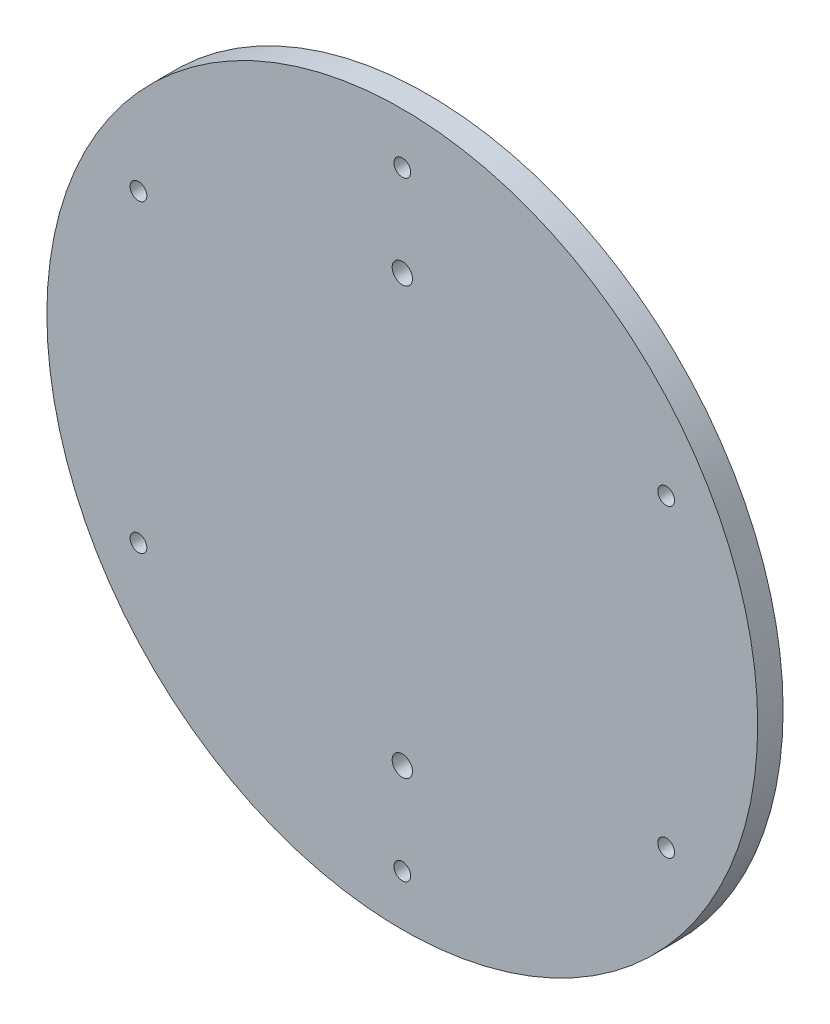
ISO-10303-21;
HEADER;
FILE_DESCRIPTION(('STEP AP214'),'2;1');
FILE_NAME('part.step','',(''),(''),'','','');
FILE_SCHEMA(('AUTOMOTIVE_DESIGN { 1 0 10303 214 1 1 1 1 }'));
ENDSEC;
DATA;
#1=APPLICATION_CONTEXT('core data for automotive mechanical design processes');
#2=APPLICATION_PROTOCOL_DEFINITION('international standard','automotive_design',2000,#1);
#3=PRODUCT_CONTEXT('',#1,'mechanical');
#4=PRODUCT('Part','Part','',(#3));
#5=PRODUCT_RELATED_PRODUCT_CATEGORY('part','',(#4));
#6=PRODUCT_DEFINITION_FORMATION('','',#4);
#7=PRODUCT_DEFINITION_CONTEXT('part definition',#1,'design');
#8=PRODUCT_DEFINITION('design','',#6,#7);
#9=PRODUCT_DEFINITION_SHAPE('','',#8);
#10=(LENGTH_UNIT() NAMED_UNIT(*) SI_UNIT(.MILLI.,.METRE.));
#11=(NAMED_UNIT(*) PLANE_ANGLE_UNIT() SI_UNIT($,.RADIAN.));
#12=(NAMED_UNIT(*) SI_UNIT($,.STERADIAN.) SOLID_ANGLE_UNIT());
#13=UNCERTAINTY_MEASURE_WITH_UNIT(LENGTH_MEASURE(1.E-05),#10,'distance_accuracy_value','');
#14=(GEOMETRIC_REPRESENTATION_CONTEXT(3) GLOBAL_UNCERTAINTY_ASSIGNED_CONTEXT((#13)) GLOBAL_UNIT_ASSIGNED_CONTEXT((#10,
#11,#12)) REPRESENTATION_CONTEXT('',''));
#15=CARTESIAN_POINT('',(0.,0.,0.));
#16=DIRECTION('',(0.,0.,1.));
#17=DIRECTION('',(1.,0.,0.));
#18=AXIS2_PLACEMENT_3D('',#15,#16,#17);
#19=CARTESIAN_POINT('',(0.,0.,5.));
#20=DIRECTION('',(0.,0.,1.));
#21=DIRECTION('',(1.,0.,0.));
#22=AXIS2_PLACEMENT_3D('',#19,#20,#21);
#23=PLANE('',#22);
#24=CARTESIAN_POINT('',(0.,42.,5.));
#25=DIRECTION('',(0.,0.,1.));
#26=DIRECTION('',(1.,0.,0.));
#27=AXIS2_PLACEMENT_3D('',#24,#25,#26);
#28=CIRCLE('',#27,2.);
#29=CARTESIAN_POINT('',(2.,42.,5.));
#30=VERTEX_POINT('',#29);
#31=EDGE_CURVE('E86',#30,#30,#28,.T.);
#32=ORIENTED_EDGE('',*,*,#31,.F.);
#33=EDGE_LOOP('',(#32));
#34=FACE_BOUND('',#33,.T.);
#35=CARTESIAN_POINT('',(0.,-42.,5.));
#36=DIRECTION('',(0.,0.,1.));
#37=DIRECTION('',(1.,0.,0.));
#38=AXIS2_PLACEMENT_3D('',#35,#36,#37);
#39=CIRCLE('',#38,2.);
#40=CARTESIAN_POINT('',(2.,-42.,5.));
#41=VERTEX_POINT('',#40);
#42=EDGE_CURVE('E80',#41,#41,#39,.T.);
#43=ORIENTED_EDGE('',*,*,#42,.F.);
#44=EDGE_LOOP('',(#43));
#45=FACE_BOUND('',#44,.T.);
#46=CARTESIAN_POINT('',(-51.9615242270663,-30.,5.));
#47=DIRECTION('',(0.,0.,1.));
#48=DIRECTION('',(1.,0.,0.));
#49=AXIS2_PLACEMENT_3D('',#46,#47,#48);
#50=CIRCLE('',#49,1.65);
#51=CARTESIAN_POINT('',(-50.3115242270663,-30.,5.));
#52=VERTEX_POINT('',#51);
#53=EDGE_CURVE('E65',#52,#52,#50,.T.);
#54=ORIENTED_EDGE('',*,*,#53,.F.);
#55=EDGE_LOOP('',(#54));
#56=FACE_BOUND('',#55,.T.);
#57=CARTESIAN_POINT('',(51.9615242270663,-30.,5.));
#58=DIRECTION('',(0.,0.,1.));
#59=DIRECTION('',(1.,0.,0.));
#60=AXIS2_PLACEMENT_3D('',#57,#58,#59);
#61=CIRCLE('',#60,1.65000000000015);
#62=CARTESIAN_POINT('',(53.6115242270665,-30.,5.));
#63=VERTEX_POINT('',#62);
#64=EDGE_CURVE('E53',#63,#63,#61,.T.);
#65=ORIENTED_EDGE('',*,*,#64,.F.);
#66=EDGE_LOOP('',(#65));
#67=FACE_BOUND('',#66,.T.);
#68=CARTESIAN_POINT('',(0.,60.,5.));
#69=DIRECTION('',(0.,0.,1.));
#70=DIRECTION('',(1.,0.,0.));
#71=AXIS2_PLACEMENT_3D('',#68,#69,#70);
#72=CIRCLE('',#71,1.65);
#73=CARTESIAN_POINT('',(1.65,60.,5.));
#74=VERTEX_POINT('',#73);
#75=EDGE_CURVE('E42',#74,#74,#72,.T.);
#76=ORIENTED_EDGE('',*,*,#75,.F.);
#77=EDGE_LOOP('',(#76));
#78=FACE_BOUND('',#77,.T.);
#79=CARTESIAN_POINT('',(0.,0.,5.));
#80=DIRECTION('',(0.,0.,1.));
#81=DIRECTION('',(1.,0.,0.));
#82=AXIS2_PLACEMENT_3D('',#79,#80,#81);
#83=CIRCLE('',#82,70.);
#84=CARTESIAN_POINT('',(70.,0.,5.));
#85=VERTEX_POINT('',#84);
#86=EDGE_CURVE('E10',#85,#85,#83,.T.);
#87=ORIENTED_EDGE('',*,*,#86,.T.);
#88=EDGE_LOOP('',(#87));
#89=FACE_BOUND('',#88,.T.);
#90=CARTESIAN_POINT('',(51.9615242270663,30.,5.));
#91=DIRECTION('',(0.,0.,1.));
#92=DIRECTION('',(1.,0.,0.));
#93=AXIS2_PLACEMENT_3D('',#90,#91,#92);
#94=CIRCLE('',#93,1.65000000000008);
#95=CARTESIAN_POINT('',(53.6115242270664,30.,5.));
#96=VERTEX_POINT('',#95);
#97=EDGE_CURVE('E47',#96,#96,#94,.T.);
#98=ORIENTED_EDGE('',*,*,#97,.F.);
#99=EDGE_LOOP('',(#98));
#100=FACE_BOUND('',#99,.T.);
#101=CARTESIAN_POINT('',(0.,-60.,5.));
#102=DIRECTION('',(0.,0.,1.));
#103=DIRECTION('',(1.,0.,0.));
#104=AXIS2_PLACEMENT_3D('',#101,#102,#103);
#105=CIRCLE('',#104,1.65);
#106=CARTESIAN_POINT('',(1.65000000000001,-60.,5.));
#107=VERTEX_POINT('',#106);
#108=EDGE_CURVE('E59',#107,#107,#105,.T.);
#109=ORIENTED_EDGE('',*,*,#108,.F.);
#110=EDGE_LOOP('',(#109));
#111=FACE_BOUND('',#110,.T.);
#112=CARTESIAN_POINT('',(-51.9615242270663,30.,5.));
#113=DIRECTION('',(0.,0.,1.));
#114=DIRECTION('',(1.,0.,0.));
#115=AXIS2_PLACEMENT_3D('',#112,#113,#114);
#116=CIRCLE('',#115,1.65);
#117=CARTESIAN_POINT('',(-50.3115242270664,30.,5.));
#118=VERTEX_POINT('',#117);
#119=EDGE_CURVE('E71',#118,#118,#116,.T.);
#120=ORIENTED_EDGE('',*,*,#119,.F.);
#121=EDGE_LOOP('',(#120));
#122=FACE_BOUND('',#121,.T.);
#123=ADVANCED_FACE('F31',(#34,#45,#56,#67,#78,#89,#100,#111,#122),#23,.T.);
#124=CARTESIAN_POINT('',(0.,0.,0.));
#125=DIRECTION('',(0.,0.,1.));
#126=DIRECTION('',(1.,0.,0.));
#127=AXIS2_PLACEMENT_3D('',#124,#125,#126);
#128=PLANE('',#127);
#129=CARTESIAN_POINT('',(0.,42.,0.));
#130=DIRECTION('',(0.,0.,1.));
#131=DIRECTION('',(1.,0.,0.));
#132=AXIS2_PLACEMENT_3D('',#129,#130,#131);
#133=CIRCLE('',#132,2.);
#134=CARTESIAN_POINT('',(2.,42.,0.));
#135=VERTEX_POINT('',#134);
#136=EDGE_CURVE('E77',#135,#135,#133,.T.);
#137=ORIENTED_EDGE('',*,*,#136,.T.);
#138=EDGE_LOOP('',(#137));
#139=FACE_BOUND('',#138,.T.);
#140=CARTESIAN_POINT('',(0.,-42.,0.));
#141=DIRECTION('',(0.,0.,1.));
#142=DIRECTION('',(1.,0.,0.));
#143=AXIS2_PLACEMENT_3D('',#140,#141,#142);
#144=CIRCLE('',#143,2.);
#145=CARTESIAN_POINT('',(2.,-42.,0.));
#146=VERTEX_POINT('',#145);
#147=EDGE_CURVE('E83',#146,#146,#144,.T.);
#148=ORIENTED_EDGE('',*,*,#147,.T.);
#149=EDGE_LOOP('',(#148));
#150=FACE_BOUND('',#149,.T.);
#151=CARTESIAN_POINT('',(0.,0.,0.));
#152=DIRECTION('',(0.,0.,1.));
#153=DIRECTION('',(1.,0.,0.));
#154=AXIS2_PLACEMENT_3D('',#151,#152,#153);
#155=CIRCLE('',#154,70.);
#156=CARTESIAN_POINT('',(70.,0.,0.));
#157=VERTEX_POINT('',#156);
#158=EDGE_CURVE('E35',#157,#157,#155,.T.);
#159=ORIENTED_EDGE('',*,*,#158,.F.);
#160=EDGE_LOOP('',(#159));
#161=FACE_BOUND('',#160,.T.);
#162=CARTESIAN_POINT('',(0.,60.,0.));
#163=DIRECTION('',(0.,0.,1.));
#164=DIRECTION('',(1.,0.,0.));
#165=AXIS2_PLACEMENT_3D('',#162,#163,#164);
#166=CIRCLE('',#165,1.65);
#167=CARTESIAN_POINT('',(1.65,60.,0.));
#168=VERTEX_POINT('',#167);
#169=EDGE_CURVE('E44',#168,#168,#166,.T.);
#170=ORIENTED_EDGE('',*,*,#169,.T.);
#171=EDGE_LOOP('',(#170));
#172=FACE_BOUND('',#171,.T.);
#173=CARTESIAN_POINT('',(51.9615242270663,30.,0.));
#174=DIRECTION('',(0.,0.,1.));
#175=DIRECTION('',(1.,0.,0.));
#176=AXIS2_PLACEMENT_3D('',#173,#174,#175);
#177=CIRCLE('',#176,1.65000000000008);
#178=CARTESIAN_POINT('',(53.6115242270664,30.,0.));
#179=VERTEX_POINT('',#178);
#180=EDGE_CURVE('E50',#179,#179,#177,.T.);
#181=ORIENTED_EDGE('',*,*,#180,.T.);
#182=EDGE_LOOP('',(#181));
#183=FACE_BOUND('',#182,.T.);
#184=CARTESIAN_POINT('',(51.9615242270663,-30.,0.));
#185=DIRECTION('',(0.,0.,1.));
#186=DIRECTION('',(1.,0.,0.));
#187=AXIS2_PLACEMENT_3D('',#184,#185,#186);
#188=CIRCLE('',#187,1.65000000000015);
#189=CARTESIAN_POINT('',(53.6115242270665,-30.,0.));
#190=VERTEX_POINT('',#189);
#191=EDGE_CURVE('E56',#190,#190,#188,.T.);
#192=ORIENTED_EDGE('',*,*,#191,.T.);
#193=EDGE_LOOP('',(#192));
#194=FACE_BOUND('',#193,.T.);
#195=CARTESIAN_POINT('',(0.,-60.,0.));
#196=DIRECTION('',(0.,0.,1.));
#197=DIRECTION('',(1.,0.,0.));
#198=AXIS2_PLACEMENT_3D('',#195,#196,#197);
#199=CIRCLE('',#198,1.65);
#200=CARTESIAN_POINT('',(1.65000000000001,-60.,0.));
#201=VERTEX_POINT('',#200);
#202=EDGE_CURVE('E62',#201,#201,#199,.T.);
#203=ORIENTED_EDGE('',*,*,#202,.T.);
#204=EDGE_LOOP('',(#203));
#205=FACE_BOUND('',#204,.T.);
#206=CARTESIAN_POINT('',(-51.9615242270663,-30.,0.));
#207=DIRECTION('',(0.,0.,1.));
#208=DIRECTION('',(1.,0.,0.));
#209=AXIS2_PLACEMENT_3D('',#206,#207,#208);
#210=CIRCLE('',#209,1.65);
#211=CARTESIAN_POINT('',(-50.3115242270663,-30.,0.));
#212=VERTEX_POINT('',#211);
#213=EDGE_CURVE('E68',#212,#212,#210,.T.);
#214=ORIENTED_EDGE('',*,*,#213,.T.);
#215=EDGE_LOOP('',(#214));
#216=FACE_BOUND('',#215,.T.);
#217=CARTESIAN_POINT('',(-51.9615242270663,30.,0.));
#218=DIRECTION('',(0.,0.,1.));
#219=DIRECTION('',(1.,0.,0.));
#220=AXIS2_PLACEMENT_3D('',#217,#218,#219);
#221=CIRCLE('',#220,1.65);
#222=CARTESIAN_POINT('',(-50.3115242270664,30.,0.));
#223=VERTEX_POINT('',#222);
#224=EDGE_CURVE('E74',#223,#223,#221,.T.);
#225=ORIENTED_EDGE('',*,*,#224,.T.);
#226=EDGE_LOOP('',(#225));
#227=FACE_BOUND('',#226,.T.);
#228=ADVANCED_FACE('F92',(#139,#150,#161,#172,#183,#194,#205,#216,#227),#128,.F.);
#229=CARTESIAN_POINT('',(0.,0.,5.));
#230=DIRECTION('',(0.,0.,-1.));
#231=DIRECTION('',(-1.,0.,0.));
#232=AXIS2_PLACEMENT_3D('',#229,#230,#231);
#233=CYLINDRICAL_SURFACE('',#232,70.);
#234=ORIENTED_EDGE('',*,*,#86,.F.);
#235=EDGE_LOOP('',(#234));
#236=FACE_BOUND('',#235,.T.);
#237=ORIENTED_EDGE('',*,*,#158,.T.);
#238=EDGE_LOOP('',(#237));
#239=FACE_BOUND('',#238,.T.);
#240=ADVANCED_FACE('F33',(#236,#239),#233,.T.);
#241=CARTESIAN_POINT('',(0.,60.,5.));
#242=DIRECTION('',(0.,0.,-1.));
#243=DIRECTION('',(-1.,0.,0.));
#244=AXIS2_PLACEMENT_3D('',#241,#242,#243);
#245=CYLINDRICAL_SURFACE('',#244,1.65);
#246=ORIENTED_EDGE('',*,*,#75,.T.);
#247=EDGE_LOOP('',(#246));
#248=FACE_BOUND('',#247,.T.);
#249=ORIENTED_EDGE('',*,*,#169,.F.);
#250=EDGE_LOOP('',(#249));
#251=FACE_BOUND('',#250,.T.);
#252=ADVANCED_FACE('F130',(#248,#251),#245,.F.);
#253=CARTESIAN_POINT('',(51.9615242270663,30.,5.));
#254=DIRECTION('',(0.,0.,-1.));
#255=DIRECTION('',(-1.,0.,0.));
#256=AXIS2_PLACEMENT_3D('',#253,#254,#255);
#257=CYLINDRICAL_SURFACE('',#256,1.65000000000008);
#258=ORIENTED_EDGE('',*,*,#97,.T.);
#259=EDGE_LOOP('',(#258));
#260=FACE_BOUND('',#259,.T.);
#261=ORIENTED_EDGE('',*,*,#180,.F.);
#262=EDGE_LOOP('',(#261));
#263=FACE_BOUND('',#262,.T.);
#264=ADVANCED_FACE('F135',(#260,#263),#257,.F.);
#265=CARTESIAN_POINT('',(51.9615242270663,-30.,5.));
#266=DIRECTION('',(0.,0.,-1.));
#267=DIRECTION('',(-1.,0.,0.));
#268=AXIS2_PLACEMENT_3D('',#265,#266,#267);
#269=CYLINDRICAL_SURFACE('',#268,1.65000000000015);
#270=ORIENTED_EDGE('',*,*,#64,.T.);
#271=EDGE_LOOP('',(#270));
#272=FACE_BOUND('',#271,.T.);
#273=ORIENTED_EDGE('',*,*,#191,.F.);
#274=EDGE_LOOP('',(#273));
#275=FACE_BOUND('',#274,.T.);
#276=ADVANCED_FACE('F139',(#272,#275),#269,.F.);
#277=CARTESIAN_POINT('',(0.,-60.,5.));
#278=DIRECTION('',(0.,0.,-1.));
#279=DIRECTION('',(-1.,0.,0.));
#280=AXIS2_PLACEMENT_3D('',#277,#278,#279);
#281=CYLINDRICAL_SURFACE('',#280,1.65);
#282=ORIENTED_EDGE('',*,*,#108,.T.);
#283=EDGE_LOOP('',(#282));
#284=FACE_BOUND('',#283,.T.);
#285=ORIENTED_EDGE('',*,*,#202,.F.);
#286=EDGE_LOOP('',(#285));
#287=FACE_BOUND('',#286,.T.);
#288=ADVANCED_FACE('F143',(#284,#287),#281,.F.);
#289=CARTESIAN_POINT('',(-51.9615242270663,-30.,5.));
#290=DIRECTION('',(0.,0.,-1.));
#291=DIRECTION('',(-1.,0.,0.));
#292=AXIS2_PLACEMENT_3D('',#289,#290,#291);
#293=CYLINDRICAL_SURFACE('',#292,1.65);
#294=ORIENTED_EDGE('',*,*,#53,.T.);
#295=EDGE_LOOP('',(#294));
#296=FACE_BOUND('',#295,.T.);
#297=ORIENTED_EDGE('',*,*,#213,.F.);
#298=EDGE_LOOP('',(#297));
#299=FACE_BOUND('',#298,.T.);
#300=ADVANCED_FACE('F122',(#296,#299),#293,.F.);
#301=CARTESIAN_POINT('',(-51.9615242270663,30.,5.));
#302=DIRECTION('',(0.,0.,-1.));
#303=DIRECTION('',(-1.,0.,0.));
#304=AXIS2_PLACEMENT_3D('',#301,#302,#303);
#305=CYLINDRICAL_SURFACE('',#304,1.65);
#306=ORIENTED_EDGE('',*,*,#119,.T.);
#307=EDGE_LOOP('',(#306));
#308=FACE_BOUND('',#307,.T.);
#309=ORIENTED_EDGE('',*,*,#224,.F.);
#310=EDGE_LOOP('',(#309));
#311=FACE_BOUND('',#310,.T.);
#312=ADVANCED_FACE('F119',(#308,#311),#305,.F.);
#313=CARTESIAN_POINT('',(0.,-42.,0.));
#314=DIRECTION('',(0.,0.,1.));
#315=DIRECTION('',(1.,0.,0.));
#316=AXIS2_PLACEMENT_3D('',#313,#314,#315);
#317=CYLINDRICAL_SURFACE('',#316,2.);
#318=ORIENTED_EDGE('',*,*,#147,.F.);
#319=EDGE_LOOP('',(#318));
#320=FACE_BOUND('',#319,.T.);
#321=ORIENTED_EDGE('',*,*,#42,.T.);
#322=EDGE_LOOP('',(#321));
#323=FACE_BOUND('',#322,.T.);
#324=ADVANCED_FACE('F98',(#320,#323),#317,.F.);
#325=CARTESIAN_POINT('',(0.,42.,0.));
#326=DIRECTION('',(0.,0.,1.));
#327=DIRECTION('',(1.,0.,0.));
#328=AXIS2_PLACEMENT_3D('',#325,#326,#327);
#329=CYLINDRICAL_SURFACE('',#328,2.);
#330=ORIENTED_EDGE('',*,*,#136,.F.);
#331=EDGE_LOOP('',(#330));
#332=FACE_BOUND('',#331,.T.);
#333=ORIENTED_EDGE('',*,*,#31,.T.);
#334=EDGE_LOOP('',(#333));
#335=FACE_BOUND('',#334,.T.);
#336=ADVANCED_FACE('F95',(#332,#335),#329,.F.);
#337=CLOSED_SHELL('',(#123,#228,#240,#252,#264,#276,#288,#300,#312,#324,#336));
#338=MANIFOLD_SOLID_BREP('B2',#337);
#339=ADVANCED_BREP_SHAPE_REPRESENTATION('',(#18,#338),#14);
#340=SHAPE_DEFINITION_REPRESENTATION(#9,#339);
ENDSEC;
END-ISO-10303-21;
